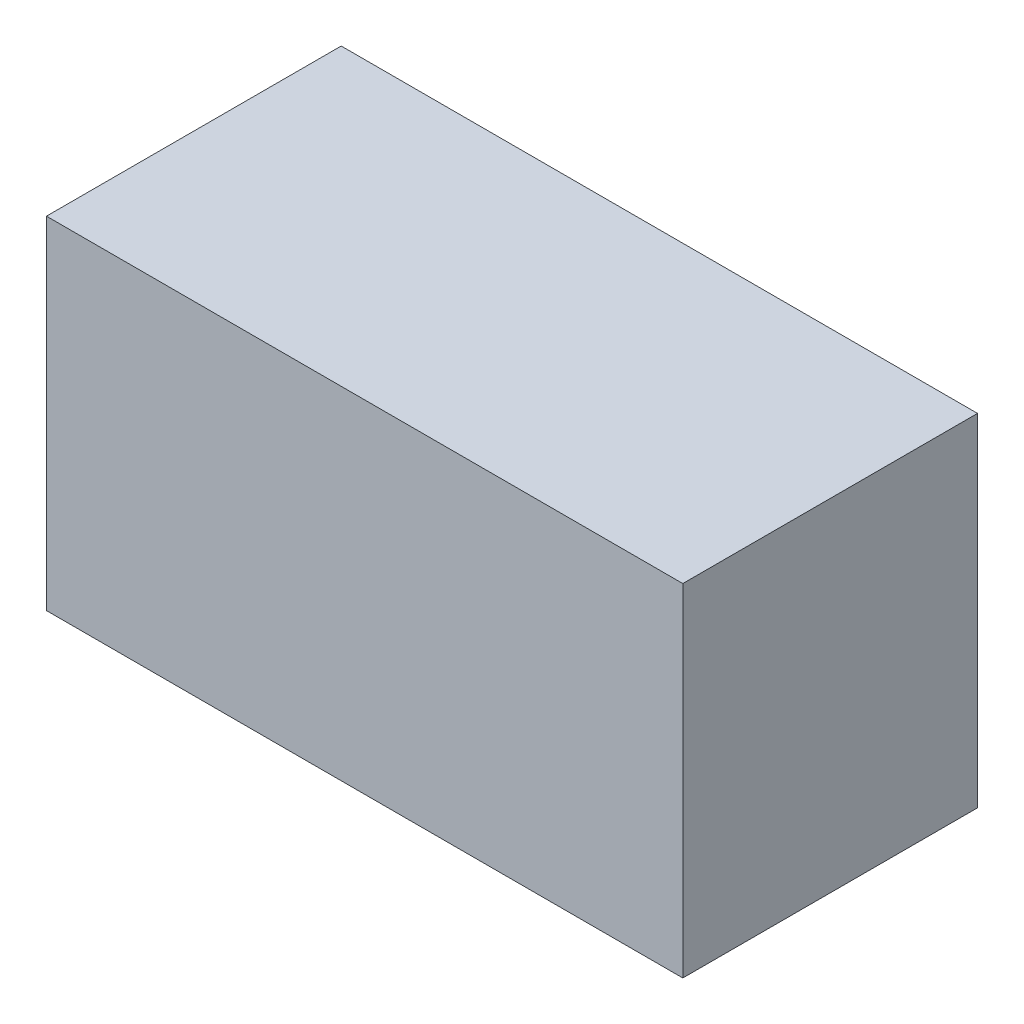
ISO-10303-21;
HEADER;
FILE_DESCRIPTION(('STEP AP214'),'2;1');
FILE_NAME('part.step','',(''),(''),'','','');
FILE_SCHEMA(('AUTOMOTIVE_DESIGN { 1 0 10303 214 1 1 1 1 }'));
ENDSEC;
DATA;
#1=APPLICATION_CONTEXT('core data for automotive mechanical design processes');
#2=APPLICATION_PROTOCOL_DEFINITION('international standard','automotive_design',2000,#1);
#3=PRODUCT_CONTEXT('',#1,'mechanical');
#4=PRODUCT('Part','Part','',(#3));
#5=PRODUCT_RELATED_PRODUCT_CATEGORY('part','',(#4));
#6=PRODUCT_DEFINITION_FORMATION('','',#4);
#7=PRODUCT_DEFINITION_CONTEXT('part definition',#1,'design');
#8=PRODUCT_DEFINITION('design','',#6,#7);
#9=PRODUCT_DEFINITION_SHAPE('','',#8);
#10=(LENGTH_UNIT() NAMED_UNIT(*) SI_UNIT(.MILLI.,.METRE.));
#11=(NAMED_UNIT(*) PLANE_ANGLE_UNIT() SI_UNIT($,.RADIAN.));
#12=(NAMED_UNIT(*) SI_UNIT($,.STERADIAN.) SOLID_ANGLE_UNIT());
#13=UNCERTAINTY_MEASURE_WITH_UNIT(LENGTH_MEASURE(1.E-05),#10,'distance_accuracy_value','');
#14=(GEOMETRIC_REPRESENTATION_CONTEXT(3) GLOBAL_UNCERTAINTY_ASSIGNED_CONTEXT((#13)) GLOBAL_UNIT_ASSIGNED_CONTEXT((#10,
#11,#12)) REPRESENTATION_CONTEXT('',''));
#15=CARTESIAN_POINT('',(0.,0.,0.));
#16=DIRECTION('',(0.,0.,1.));
#17=DIRECTION('',(1.,0.,0.));
#18=AXIS2_PLACEMENT_3D('',#15,#16,#17);
#19=CARTESIAN_POINT('',(47.5,51.,22.));
#20=DIRECTION('',(-1.,0.,0.));
#21=DIRECTION('',(0.,0.,1.));
#22=AXIS2_PLACEMENT_3D('',#19,#20,#21);
#23=PLANE('',#22);
#24=DIRECTION('',(0.,0.,-1.));
#25=VECTOR('',#24,1.);
#26=CARTESIAN_POINT('',(47.5,0.,22.));
#27=LINE('',#26,#25);
#28=CARTESIAN_POINT('',(47.5,0.,22.));
#29=VERTEX_POINT('',#28);
#30=CARTESIAN_POINT('',(47.5,0.,-22.));
#31=VERTEX_POINT('',#30);
#32=EDGE_CURVE('E95',#29,#31,#27,.T.);
#33=ORIENTED_EDGE('',*,*,#32,.T.);
#34=DIRECTION('',(0.,-1.,0.));
#35=VECTOR('',#34,1.);
#36=CARTESIAN_POINT('',(47.5,51.,-22.));
#37=LINE('',#36,#35);
#38=CARTESIAN_POINT('',(47.5,51.,-22.));
#39=VERTEX_POINT('',#38);
#40=EDGE_CURVE('E11',#39,#31,#37,.T.);
#41=ORIENTED_EDGE('',*,*,#40,.F.);
#42=DIRECTION('',(0.,0.,-1.));
#43=VECTOR('',#42,1.);
#44=CARTESIAN_POINT('',(47.5,51.,22.));
#45=LINE('',#44,#43);
#46=CARTESIAN_POINT('',(47.5,51.,22.));
#47=VERTEX_POINT('',#46);
#48=EDGE_CURVE('E83',#47,#39,#45,.T.);
#49=ORIENTED_EDGE('',*,*,#48,.F.);
#50=DIRECTION('',(0.,-1.,0.));
#51=VECTOR('',#50,1.);
#52=CARTESIAN_POINT('',(47.5,51.,22.));
#53=LINE('',#52,#51);
#54=EDGE_CURVE('E91',#47,#29,#53,.T.);
#55=ORIENTED_EDGE('',*,*,#54,.T.);
#56=EDGE_LOOP('',(#33,#41,#49,#55));
#57=FACE_BOUND('',#56,.T.);
#58=ADVANCED_FACE('F32',(#57),#23,.F.);
#59=CARTESIAN_POINT('',(-47.5,51.,-22.));
#60=DIRECTION('',(0.,0.,1.));
#61=DIRECTION('',(1.,0.,0.));
#62=AXIS2_PLACEMENT_3D('',#59,#60,#61);
#63=PLANE('',#62);
#64=DIRECTION('',(-1.,0.,0.));
#65=VECTOR('',#64,1.);
#66=CARTESIAN_POINT('',(-47.5,0.,-22.));
#67=LINE('',#66,#65);
#68=CARTESIAN_POINT('',(-47.5,0.,-22.));
#69=VERTEX_POINT('',#68);
#70=EDGE_CURVE('E87',#31,#69,#67,.T.);
#71=ORIENTED_EDGE('',*,*,#70,.T.);
#72=DIRECTION('',(0.,-1.,0.));
#73=VECTOR('',#72,1.);
#74=CARTESIAN_POINT('',(-47.5,51.,-22.));
#75=LINE('',#74,#73);
#76=CARTESIAN_POINT('',(-47.5,51.,-22.));
#77=VERTEX_POINT('',#76);
#78=EDGE_CURVE('E40',#77,#69,#75,.T.);
#79=ORIENTED_EDGE('',*,*,#78,.F.);
#80=DIRECTION('',(-1.,0.,0.));
#81=VECTOR('',#80,1.);
#82=CARTESIAN_POINT('',(-47.5,51.,-22.));
#83=LINE('',#82,#81);
#84=EDGE_CURVE('E78',#39,#77,#83,.T.);
#85=ORIENTED_EDGE('',*,*,#84,.F.);
#86=ORIENTED_EDGE('',*,*,#40,.T.);
#87=EDGE_LOOP('',(#71,#79,#85,#86));
#88=FACE_BOUND('',#87,.T.);
#89=ADVANCED_FACE('F86',(#88),#63,.F.);
#90=CARTESIAN_POINT('',(-47.5,51.,22.));
#91=DIRECTION('',(1.,0.,0.));
#92=DIRECTION('',(0.,0.,-1.));
#93=AXIS2_PLACEMENT_3D('',#90,#91,#92);
#94=PLANE('',#93);
#95=DIRECTION('',(0.,0.,1.));
#96=VECTOR('',#95,1.);
#97=CARTESIAN_POINT('',(-47.5,0.,22.));
#98=LINE('',#97,#96);
#99=CARTESIAN_POINT('',(-47.5,0.,22.));
#100=VERTEX_POINT('',#99);
#101=EDGE_CURVE('E65',#69,#100,#98,.T.);
#102=ORIENTED_EDGE('',*,*,#101,.T.);
#103=DIRECTION('',(0.,-1.,0.));
#104=VECTOR('',#103,1.);
#105=CARTESIAN_POINT('',(-47.5,51.,22.));
#106=LINE('',#105,#104);
#107=CARTESIAN_POINT('',(-47.5,51.,22.));
#108=VERTEX_POINT('',#107);
#109=EDGE_CURVE('E88',#108,#100,#106,.T.);
#110=ORIENTED_EDGE('',*,*,#109,.F.);
#111=DIRECTION('',(0.,0.,1.));
#112=VECTOR('',#111,1.);
#113=CARTESIAN_POINT('',(-47.5,51.,22.));
#114=LINE('',#113,#112);
#115=EDGE_CURVE('E81',#77,#108,#114,.T.);
#116=ORIENTED_EDGE('',*,*,#115,.F.);
#117=ORIENTED_EDGE('',*,*,#78,.T.);
#118=EDGE_LOOP('',(#102,#110,#116,#117));
#119=FACE_BOUND('',#118,.T.);
#120=ADVANCED_FACE('F89',(#119),#94,.F.);
#121=CARTESIAN_POINT('',(-47.5,51.,22.));
#122=DIRECTION('',(0.,0.,-1.));
#123=DIRECTION('',(-1.,0.,0.));
#124=AXIS2_PLACEMENT_3D('',#121,#122,#123);
#125=PLANE('',#124);
#126=DIRECTION('',(1.,0.,0.));
#127=VECTOR('',#126,1.);
#128=CARTESIAN_POINT('',(-47.5,0.,22.));
#129=LINE('',#128,#127);
#130=EDGE_CURVE('E71',#100,#29,#129,.T.);
#131=ORIENTED_EDGE('',*,*,#130,.T.);
#132=ORIENTED_EDGE('',*,*,#54,.F.);
#133=DIRECTION('',(1.,0.,0.));
#134=VECTOR('',#133,1.);
#135=CARTESIAN_POINT('',(-47.5,51.,22.));
#136=LINE('',#135,#134);
#137=EDGE_CURVE('E48',#108,#47,#136,.T.);
#138=ORIENTED_EDGE('',*,*,#137,.F.);
#139=ORIENTED_EDGE('',*,*,#109,.T.);
#140=EDGE_LOOP('',(#131,#132,#138,#139));
#141=FACE_BOUND('',#140,.T.);
#142=ADVANCED_FACE('F102',(#141),#125,.F.);
#143=CARTESIAN_POINT('',(0.,51.,0.));
#144=DIRECTION('',(0.,-1.,0.));
#145=DIRECTION('',(0.,0.,-1.));
#146=AXIS2_PLACEMENT_3D('',#143,#144,#145);
#147=PLANE('',#146);
#148=ORIENTED_EDGE('',*,*,#48,.T.);
#149=ORIENTED_EDGE('',*,*,#84,.T.);
#150=ORIENTED_EDGE('',*,*,#115,.T.);
#151=ORIENTED_EDGE('',*,*,#137,.T.);
#152=EDGE_LOOP('',(#148,#149,#150,#151));
#153=FACE_BOUND('',#152,.T.);
#154=ADVANCED_FACE('F79',(#153),#147,.F.);
#155=CARTESIAN_POINT('',(0.,0.,0.));
#156=DIRECTION('',(0.,-1.,0.));
#157=DIRECTION('',(0.,0.,-1.));
#158=AXIS2_PLACEMENT_3D('',#155,#156,#157);
#159=PLANE('',#158);
#160=ORIENTED_EDGE('',*,*,#32,.F.);
#161=ORIENTED_EDGE('',*,*,#130,.F.);
#162=ORIENTED_EDGE('',*,*,#101,.F.);
#163=ORIENTED_EDGE('',*,*,#70,.F.);
#164=EDGE_LOOP('',(#160,#161,#162,#163));
#165=FACE_BOUND('',#164,.T.);
#166=ADVANCED_FACE('F105',(#165),#159,.T.);
#167=CLOSED_SHELL('',(#58,#89,#120,#142,#154,#166));
#168=MANIFOLD_SOLID_BREP('B2',#167);
#169=ADVANCED_BREP_SHAPE_REPRESENTATION('',(#18,#168),#14);
#170=SHAPE_DEFINITION_REPRESENTATION(#9,#169);
ENDSEC;
END-ISO-10303-21;
